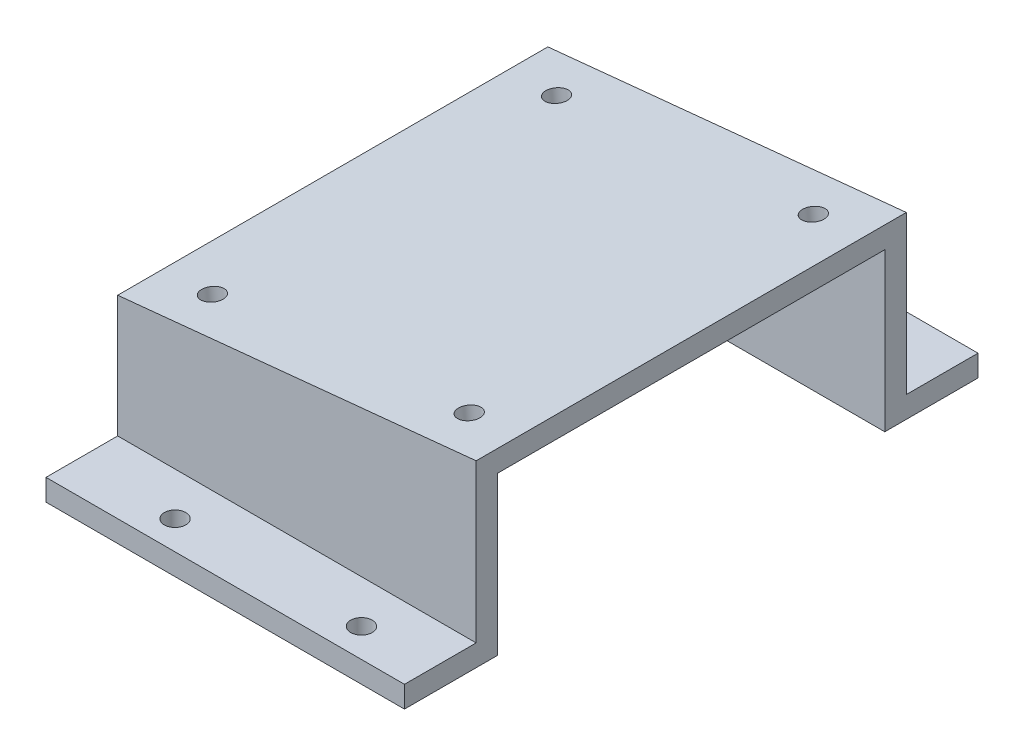
ISO-10303-21;
HEADER;
FILE_DESCRIPTION(('STEP AP214'),'2;1');
FILE_NAME('part.step','',(''),(''),'','','');
FILE_SCHEMA(('AUTOMOTIVE_DESIGN { 1 0 10303 214 1 1 1 1 }'));
ENDSEC;
DATA;
#1=APPLICATION_CONTEXT('core data for automotive mechanical design processes');
#2=APPLICATION_PROTOCOL_DEFINITION('international standard','automotive_design',2000,#1);
#3=PRODUCT_CONTEXT('',#1,'mechanical');
#4=PRODUCT('Part','Part','',(#3));
#5=PRODUCT_RELATED_PRODUCT_CATEGORY('part','',(#4));
#6=PRODUCT_DEFINITION_FORMATION('','',#4);
#7=PRODUCT_DEFINITION_CONTEXT('part definition',#1,'design');
#8=PRODUCT_DEFINITION('design','',#6,#7);
#9=PRODUCT_DEFINITION_SHAPE('','',#8);
#10=(LENGTH_UNIT() NAMED_UNIT(*) SI_UNIT(.MILLI.,.METRE.));
#11=(NAMED_UNIT(*) PLANE_ANGLE_UNIT() SI_UNIT($,.RADIAN.));
#12=(NAMED_UNIT(*) SI_UNIT($,.STERADIAN.) SOLID_ANGLE_UNIT());
#13=UNCERTAINTY_MEASURE_WITH_UNIT(LENGTH_MEASURE(1.E-05),#10,'distance_accuracy_value','');
#14=(GEOMETRIC_REPRESENTATION_CONTEXT(3) GLOBAL_UNCERTAINTY_ASSIGNED_CONTEXT((#13)) GLOBAL_UNIT_ASSIGNED_CONTEXT((#10,
#11,#12)) REPRESENTATION_CONTEXT('',''));
#15=CARTESIAN_POINT('',(0.,0.,0.));
#16=DIRECTION('',(0.,0.,1.));
#17=DIRECTION('',(1.,0.,0.));
#18=AXIS2_PLACEMENT_3D('',#15,#16,#17);
#19=CARTESIAN_POINT('',(0.,0.,3.));
#20=DIRECTION('',(0.,0.,-1.));
#21=DIRECTION('',(-1.,0.,0.));
#22=AXIS2_PLACEMENT_3D('',#19,#20,#21);
#23=PLANE('',#22);
#24=DIRECTION('',(0.995037190209989,0.0995037190209989,0.));
#25=VECTOR('',#24,1.);
#26=CARTESIAN_POINT('',(0.,17.,3.));
#27=LINE('',#26,#25);
#28=CARTESIAN_POINT('',(0.,17.,3.));
#29=VERTEX_POINT('',#28);
#30=CARTESIAN_POINT('',(50.,22.,3.));
#31=VERTEX_POINT('',#30);
#32=EDGE_CURVE('E233',#29,#31,#27,.T.);
#33=ORIENTED_EDGE('',*,*,#32,.F.);
#34=DIRECTION('',(0.,-1.,0.));
#35=VECTOR('',#34,1.);
#36=CARTESIAN_POINT('',(0.,0.,3.));
#37=LINE('',#36,#35);
#38=CARTESIAN_POINT('',(0.,0.,3.));
#39=VERTEX_POINT('',#38);
#40=EDGE_CURVE('E249',#29,#39,#37,.T.);
#41=ORIENTED_EDGE('',*,*,#40,.T.);
#42=DIRECTION('',(1.,0.,0.));
#43=VECTOR('',#42,1.);
#44=CARTESIAN_POINT('',(0.,0.,3.));
#45=LINE('',#44,#43);
#46=CARTESIAN_POINT('',(50.,0.,3.));
#47=VERTEX_POINT('',#46);
#48=EDGE_CURVE('E252',#39,#47,#45,.T.);
#49=ORIENTED_EDGE('',*,*,#48,.T.);
#50=DIRECTION('',(0.,1.,0.));
#51=VECTOR('',#50,1.);
#52=CARTESIAN_POINT('',(50.,25.,3.));
#53=LINE('',#52,#51);
#54=EDGE_CURVE('E143',#47,#31,#53,.T.);
#55=ORIENTED_EDGE('',*,*,#54,.T.);
#56=EDGE_LOOP('',(#33,#41,#49,#55));
#57=FACE_BOUND('',#56,.T.);
#58=ADVANCED_FACE('F44',(#57),#23,.F.);
#59=CARTESIAN_POINT('',(0.,0.,3.));
#60=DIRECTION('',(1.,0.,0.));
#61=DIRECTION('',(0.,0.,-1.));
#62=AXIS2_PLACEMENT_3D('',#59,#60,#61);
#63=PLANE('',#62);
#64=DIRECTION('',(0.,-1.,0.));
#65=VECTOR('',#64,1.);
#66=CARTESIAN_POINT('',(0.,0.,0.));
#67=LINE('',#66,#65);
#68=CARTESIAN_POINT('',(0.,20.,0.));
#69=VERTEX_POINT('',#68);
#70=CARTESIAN_POINT('',(0.,3.,0.));
#71=VERTEX_POINT('',#70);
#72=EDGE_CURVE('E248',#69,#71,#67,.T.);
#73=ORIENTED_EDGE('',*,*,#72,.T.);
#74=DIRECTION('',(0.,0.,1.));
#75=VECTOR('',#74,1.);
#76=CARTESIAN_POINT('',(0.,3.,-10.));
#77=LINE('',#76,#75);
#78=CARTESIAN_POINT('',(0.,3.,-10.));
#79=VERTEX_POINT('',#78);
#80=EDGE_CURVE('E177',#79,#71,#77,.T.);
#81=ORIENTED_EDGE('',*,*,#80,.F.);
#82=DIRECTION('',(0.,1.,0.));
#83=VECTOR('',#82,1.);
#84=CARTESIAN_POINT('',(0.,0.,-10.));
#85=LINE('',#84,#83);
#86=CARTESIAN_POINT('',(0.,0.,-10.));
#87=VERTEX_POINT('',#86);
#88=EDGE_CURVE('E156',#87,#79,#85,.T.);
#89=ORIENTED_EDGE('',*,*,#88,.F.);
#90=DIRECTION('',(0.,0.,-1.));
#91=VECTOR('',#90,1.);
#92=CARTESIAN_POINT('',(0.,0.,3.));
#93=LINE('',#92,#91);
#94=EDGE_CURVE('E11',#39,#87,#93,.T.);
#95=ORIENTED_EDGE('',*,*,#94,.F.);
#96=ORIENTED_EDGE('',*,*,#40,.F.);
#97=DIRECTION('',(0.,0.,-1.));
#98=VECTOR('',#97,1.);
#99=CARTESIAN_POINT('',(0.,17.,57.));
#100=LINE('',#99,#98);
#101=CARTESIAN_POINT('',(0.,17.,57.));
#102=VERTEX_POINT('',#101);
#103=EDGE_CURVE('E244',#102,#29,#100,.T.);
#104=ORIENTED_EDGE('',*,*,#103,.F.);
#105=DIRECTION('',(0.,-1.,0.));
#106=VECTOR('',#105,1.);
#107=CARTESIAN_POINT('',(0.,0.,57.));
#108=LINE('',#107,#106);
#109=CARTESIAN_POINT('',(0.,0.,57.));
#110=VERTEX_POINT('',#109);
#111=EDGE_CURVE('E205',#102,#110,#108,.T.);
#112=ORIENTED_EDGE('',*,*,#111,.T.);
#113=DIRECTION('',(0.,0.,-1.));
#114=VECTOR('',#113,1.);
#115=CARTESIAN_POINT('',(0.,0.,60.));
#116=LINE('',#115,#114);
#117=CARTESIAN_POINT('',(0.,0.,70.));
#118=VERTEX_POINT('',#117);
#119=EDGE_CURVE('E229',#118,#110,#116,.T.);
#120=ORIENTED_EDGE('',*,*,#119,.F.);
#121=DIRECTION('',(0.,-1.,0.));
#122=VECTOR('',#121,1.);
#123=CARTESIAN_POINT('',(0.,0.,70.));
#124=LINE('',#123,#122);
#125=CARTESIAN_POINT('',(0.,2.99999999999999,70.));
#126=VERTEX_POINT('',#125);
#127=EDGE_CURVE('E191',#126,#118,#124,.T.);
#128=ORIENTED_EDGE('',*,*,#127,.F.);
#129=DIRECTION('',(0.,0.,-1.));
#130=VECTOR('',#129,1.);
#131=CARTESIAN_POINT('',(0.,2.99999999999999,70.));
#132=LINE('',#131,#130);
#133=CARTESIAN_POINT('',(0.,2.99999999999999,60.));
#134=VERTEX_POINT('',#133);
#135=EDGE_CURVE('E195',#126,#134,#132,.T.);
#136=ORIENTED_EDGE('',*,*,#135,.T.);
#137=DIRECTION('',(0.,-1.,0.));
#138=VECTOR('',#137,1.);
#139=CARTESIAN_POINT('',(0.,0.,60.));
#140=LINE('',#139,#138);
#141=CARTESIAN_POINT('',(0.,20.,60.));
#142=VERTEX_POINT('',#141);
#143=EDGE_CURVE('E206',#142,#134,#140,.T.);
#144=ORIENTED_EDGE('',*,*,#143,.F.);
#145=DIRECTION('',(0.,0.,-1.));
#146=VECTOR('',#145,1.);
#147=CARTESIAN_POINT('',(0.,20.,3.));
#148=LINE('',#147,#146);
#149=EDGE_CURVE('E258',#142,#69,#148,.T.);
#150=ORIENTED_EDGE('',*,*,#149,.T.);
#151=EDGE_LOOP('',(#73,#81,#89,#95,#96,#104,#112,#120,#128,#136,#144,#150));
#152=FACE_BOUND('',#151,.T.);
#153=ADVANCED_FACE('F46',(#152),#63,.F.);
#154=CARTESIAN_POINT('',(0.,0.,3.));
#155=DIRECTION('',(0.,1.,0.));
#156=DIRECTION('',(0.,0.,1.));
#157=AXIS2_PLACEMENT_3D('',#154,#155,#156);
#158=PLANE('',#157);
#159=CARTESIAN_POINT('',(14.,0.,-6.00000000000001));
#160=DIRECTION('',(0.,1.,0.));
#161=DIRECTION('',(0.,0.,1.));
#162=AXIS2_PLACEMENT_3D('',#159,#160,#161);
#163=CIRCLE('',#162,1.5);
#164=CARTESIAN_POINT('',(14.,0.,-4.5));
#165=VERTEX_POINT('',#164);
#166=EDGE_CURVE('E310',#165,#165,#163,.T.);
#167=ORIENTED_EDGE('',*,*,#166,.T.);
#168=EDGE_LOOP('',(#167));
#169=FACE_BOUND('',#168,.T.);
#170=CARTESIAN_POINT('',(40.,0.,-6.00000000000001));
#171=DIRECTION('',(0.,1.,0.));
#172=DIRECTION('',(0.,0.,1.));
#173=AXIS2_PLACEMENT_3D('',#170,#171,#172);
#174=CIRCLE('',#173,1.5);
#175=CARTESIAN_POINT('',(40.,0.,-4.5));
#176=VERTEX_POINT('',#175);
#177=EDGE_CURVE('E306',#176,#176,#174,.T.);
#178=ORIENTED_EDGE('',*,*,#177,.T.);
#179=EDGE_LOOP('',(#178));
#180=FACE_BOUND('',#179,.T.);
#181=ORIENTED_EDGE('',*,*,#94,.T.);
#182=DIRECTION('',(-1.,0.,0.));
#183=VECTOR('',#182,1.);
#184=CARTESIAN_POINT('',(50.,0.,-10.));
#185=LINE('',#184,#183);
#186=CARTESIAN_POINT('',(50.,0.,-10.));
#187=VERTEX_POINT('',#186);
#188=EDGE_CURVE('E150',#187,#87,#185,.T.);
#189=ORIENTED_EDGE('',*,*,#188,.F.);
#190=DIRECTION('',(0.,0.,-1.));
#191=VECTOR('',#190,1.);
#192=CARTESIAN_POINT('',(50.,0.,3.));
#193=LINE('',#192,#191);
#194=EDGE_CURVE('E54',#47,#187,#193,.T.);
#195=ORIENTED_EDGE('',*,*,#194,.F.);
#196=ORIENTED_EDGE('',*,*,#48,.F.);
#197=EDGE_LOOP('',(#181,#189,#195,#196));
#198=FACE_BOUND('',#197,.T.);
#199=ADVANCED_FACE('F151',(#169,#180,#198),#158,.F.);
#200=CARTESIAN_POINT('',(50.,25.,3.));
#201=DIRECTION('',(-1.,0.,0.));
#202=DIRECTION('',(0.,-1.,0.));
#203=AXIS2_PLACEMENT_3D('',#200,#201,#202);
#204=PLANE('',#203);
#205=ORIENTED_EDGE('',*,*,#194,.T.);
#206=DIRECTION('',(0.,-1.,0.));
#207=VECTOR('',#206,1.);
#208=CARTESIAN_POINT('',(50.,2.99999999999999,-10.));
#209=LINE('',#208,#207);
#210=CARTESIAN_POINT('',(50.,2.99999999999999,-10.));
#211=VERTEX_POINT('',#210);
#212=EDGE_CURVE('E141',#211,#187,#209,.T.);
#213=ORIENTED_EDGE('',*,*,#212,.F.);
#214=DIRECTION('',(0.,0.,1.));
#215=VECTOR('',#214,1.);
#216=CARTESIAN_POINT('',(50.,2.99999999999999,-10.));
#217=LINE('',#216,#215);
#218=CARTESIAN_POINT('',(50.,2.99999999999999,0.));
#219=VERTEX_POINT('',#218);
#220=EDGE_CURVE('E173',#211,#219,#217,.T.);
#221=ORIENTED_EDGE('',*,*,#220,.T.);
#222=DIRECTION('',(0.,1.,0.));
#223=VECTOR('',#222,1.);
#224=CARTESIAN_POINT('',(50.,25.,0.));
#225=LINE('',#224,#223);
#226=CARTESIAN_POINT('',(50.,25.,0.));
#227=VERTEX_POINT('',#226);
#228=EDGE_CURVE('E261',#219,#227,#225,.T.);
#229=ORIENTED_EDGE('',*,*,#228,.T.);
#230=DIRECTION('',(0.,0.,-1.));
#231=VECTOR('',#230,1.);
#232=CARTESIAN_POINT('',(50.,25.,3.));
#233=LINE('',#232,#231);
#234=CARTESIAN_POINT('',(50.,25.,60.));
#235=VERTEX_POINT('',#234);
#236=EDGE_CURVE('E147',#235,#227,#233,.T.);
#237=ORIENTED_EDGE('',*,*,#236,.F.);
#238=DIRECTION('',(0.,1.,0.));
#239=VECTOR('',#238,1.);
#240=CARTESIAN_POINT('',(50.,25.,60.));
#241=LINE('',#240,#239);
#242=CARTESIAN_POINT('',(50.,3.,60.));
#243=VERTEX_POINT('',#242);
#244=EDGE_CURVE('E209',#243,#235,#241,.T.);
#245=ORIENTED_EDGE('',*,*,#244,.F.);
#246=DIRECTION('',(0.,0.,-1.));
#247=VECTOR('',#246,1.);
#248=CARTESIAN_POINT('',(50.,2.99999999999999,70.));
#249=LINE('',#248,#247);
#250=CARTESIAN_POINT('',(50.,2.99999999999999,70.));
#251=VERTEX_POINT('',#250);
#252=EDGE_CURVE('E201',#251,#243,#249,.T.);
#253=ORIENTED_EDGE('',*,*,#252,.F.);
#254=DIRECTION('',(0.,1.,0.));
#255=VECTOR('',#254,1.);
#256=CARTESIAN_POINT('',(50.,2.99999999999999,70.));
#257=LINE('',#256,#255);
#258=CARTESIAN_POINT('',(50.,0.,70.));
#259=VERTEX_POINT('',#258);
#260=EDGE_CURVE('E185',#259,#251,#257,.T.);
#261=ORIENTED_EDGE('',*,*,#260,.F.);
#262=DIRECTION('',(0.,0.,-1.));
#263=VECTOR('',#262,1.);
#264=CARTESIAN_POINT('',(50.,0.,60.));
#265=LINE('',#264,#263);
#266=CARTESIAN_POINT('',(50.,0.,57.));
#267=VERTEX_POINT('',#266);
#268=EDGE_CURVE('E217',#259,#267,#265,.T.);
#269=ORIENTED_EDGE('',*,*,#268,.T.);
#270=DIRECTION('',(0.,1.,0.));
#271=VECTOR('',#270,1.);
#272=CARTESIAN_POINT('',(50.,25.,57.));
#273=LINE('',#272,#271);
#274=CARTESIAN_POINT('',(50.,22.,57.));
#275=VERTEX_POINT('',#274);
#276=EDGE_CURVE('E210',#267,#275,#273,.T.);
#277=ORIENTED_EDGE('',*,*,#276,.T.);
#278=DIRECTION('',(0.,0.,-1.));
#279=VECTOR('',#278,1.);
#280=CARTESIAN_POINT('',(50.,22.,57.));
#281=LINE('',#280,#279);
#282=EDGE_CURVE('E238',#275,#31,#281,.T.);
#283=ORIENTED_EDGE('',*,*,#282,.T.);
#284=ORIENTED_EDGE('',*,*,#54,.F.);
#285=EDGE_LOOP('',(#205,#213,#221,#229,#237,#245,#253,#261,#269,#277,#283,#284));
#286=FACE_BOUND('',#285,.T.);
#287=ADVANCED_FACE('F138',(#286),#204,.F.);
#288=CARTESIAN_POINT('',(0.,20.,3.));
#289=DIRECTION('',(0.0995037190209989,-0.995037190209989,0.));
#290=DIRECTION('',(0.995037190209989,0.0995037190209989,0.));
#291=AXIS2_PLACEMENT_3D('',#288,#289,#290);
#292=PLANE('',#291);
#293=CARTESIAN_POINT('',(43.0347396685301,24.303473966853,6.00000000000001));
#294=DIRECTION('',(-0.099503719020999,0.995037190209989,0.));
#295=DIRECTION('',(-0.995037190209989,-0.099503719020999,0.));
#296=AXIS2_PLACEMENT_3D('',#293,#294,#295);
#297=CIRCLE('',#296,1.50000000000001);
#298=CARTESIAN_POINT('',(41.5421838832151,24.1542183883215,6.00000000000001));
#299=VERTEX_POINT('',#298);
#300=EDGE_CURVE('E644',#299,#299,#297,.T.);
#301=ORIENTED_EDGE('',*,*,#300,.F.);
#302=EDGE_LOOP('',(#301));
#303=FACE_BOUND('',#302,.T.);
#304=CARTESIAN_POINT('',(7.21340082097049,20.7213400820971,54.));
#305=DIRECTION('',(-0.099503719020999,0.995037190209989,0.));
#306=DIRECTION('',(-0.995037190209989,-0.099503719020999,0.));
#307=AXIS2_PLACEMENT_3D('',#304,#305,#306);
#308=CIRCLE('',#307,1.5);
#309=CARTESIAN_POINT('',(5.72084503565551,20.5720845035656,54.));
#310=VERTEX_POINT('',#309);
#311=EDGE_CURVE('E646',#310,#310,#308,.T.);
#312=ORIENTED_EDGE('',*,*,#311,.F.);
#313=EDGE_LOOP('',(#312));
#314=FACE_BOUND('',#313,.T.);
#315=CARTESIAN_POINT('',(7.21340082097048,20.7213400820971,6.00000000000001));
#316=DIRECTION('',(-0.099503719020999,0.995037190209989,0.));
#317=DIRECTION('',(0.995037190209989,0.099503719020999,0.));
#318=AXIS2_PLACEMENT_3D('',#315,#316,#317);
#319=CIRCLE('',#318,1.5);
#320=CARTESIAN_POINT('',(8.70595660628546,20.8705956606286,6.00000000000001));
#321=VERTEX_POINT('',#320);
#322=EDGE_CURVE('E653',#321,#321,#319,.T.);
#323=ORIENTED_EDGE('',*,*,#322,.F.);
#324=EDGE_LOOP('',(#323));
#325=FACE_BOUND('',#324,.T.);
#326=CARTESIAN_POINT('',(43.0347396685301,24.303473966853,54.));
#327=DIRECTION('',(-0.099503719020999,0.995037190209989,0.));
#328=DIRECTION('',(0.995037190209989,0.099503719020999,0.));
#329=AXIS2_PLACEMENT_3D('',#326,#327,#328);
#330=CIRCLE('',#329,1.50000000000001);
#331=CARTESIAN_POINT('',(44.5272954538451,24.4527295453845,54.));
#332=VERTEX_POINT('',#331);
#333=EDGE_CURVE('E277',#332,#332,#330,.T.);
#334=ORIENTED_EDGE('',*,*,#333,.F.);
#335=EDGE_LOOP('',(#334));
#336=FACE_BOUND('',#335,.T.);
#337=DIRECTION('',(-0.995037190209989,-0.0995037190209989,0.));
#338=VECTOR('',#337,1.);
#339=CARTESIAN_POINT('',(0.,20.,0.));
#340=LINE('',#339,#338);
#341=EDGE_CURVE('E253',#227,#69,#340,.T.);
#342=ORIENTED_EDGE('',*,*,#341,.T.);
#343=ORIENTED_EDGE('',*,*,#149,.F.);
#344=DIRECTION('',(-0.995037190209989,-0.0995037190209989,0.));
#345=VECTOR('',#344,1.);
#346=CARTESIAN_POINT('',(0.,20.,60.));
#347=LINE('',#346,#345);
#348=EDGE_CURVE('E213',#235,#142,#347,.T.);
#349=ORIENTED_EDGE('',*,*,#348,.F.);
#350=ORIENTED_EDGE('',*,*,#236,.T.);
#351=EDGE_LOOP('',(#342,#343,#349,#350));
#352=FACE_BOUND('',#351,.T.);
#353=ADVANCED_FACE('F356',(#303,#314,#325,#336,#352),#292,.F.);
#354=CARTESIAN_POINT('',(0.,0.,0.));
#355=DIRECTION('',(0.,0.,-1.));
#356=DIRECTION('',(-1.,0.,0.));
#357=AXIS2_PLACEMENT_3D('',#354,#355,#356);
#358=PLANE('',#357);
#359=DIRECTION('',(1.,0.,0.));
#360=VECTOR('',#359,1.);
#361=CARTESIAN_POINT('',(0.,3.,0.));
#362=LINE('',#361,#360);
#363=EDGE_CURVE('E62',#71,#219,#362,.T.);
#364=ORIENTED_EDGE('',*,*,#363,.F.);
#365=ORIENTED_EDGE('',*,*,#72,.F.);
#366=ORIENTED_EDGE('',*,*,#341,.F.);
#367=ORIENTED_EDGE('',*,*,#228,.F.);
#368=EDGE_LOOP('',(#364,#365,#366,#367));
#369=FACE_BOUND('',#368,.T.);
#370=ADVANCED_FACE('F353',(#369),#358,.T.);
#371=CARTESIAN_POINT('',(0.,17.,57.));
#372=DIRECTION('',(-0.0995037190209989,0.995037190209989,0.));
#373=DIRECTION('',(-0.995037190209989,-0.0995037190209989,0.));
#374=AXIS2_PLACEMENT_3D('',#371,#372,#373);
#375=PLANE('',#374);
#376=CARTESIAN_POINT('',(43.3317693715004,21.33317693715,6.00000000000001));
#377=DIRECTION('',(-0.0995037190209989,0.995037190209989,0.));
#378=DIRECTION('',(-0.995037190209989,-0.0995037190209989,0.));
#379=AXIS2_PLACEMENT_3D('',#376,#377,#378);
#380=CIRCLE('',#379,1.50000000000001);
#381=CARTESIAN_POINT('',(41.8392135861854,21.1839213586185,6.00000000000001));
#382=VERTEX_POINT('',#381);
#383=EDGE_CURVE('E48',#382,#382,#380,.T.);
#384=ORIENTED_EDGE('',*,*,#383,.T.);
#385=EDGE_LOOP('',(#384));
#386=FACE_BOUND('',#385,.T.);
#387=CARTESIAN_POINT('',(7.51043052394079,17.7510430523941,54.));
#388=DIRECTION('',(-0.0995037190209989,0.995037190209989,0.));
#389=DIRECTION('',(-0.995037190209989,-0.0995037190209989,0.));
#390=AXIS2_PLACEMENT_3D('',#387,#388,#389);
#391=CIRCLE('',#390,1.5);
#392=CARTESIAN_POINT('',(6.0178747386258,17.6017874738626,54.));
#393=VERTEX_POINT('',#392);
#394=EDGE_CURVE('E280',#393,#393,#391,.T.);
#395=ORIENTED_EDGE('',*,*,#394,.T.);
#396=EDGE_LOOP('',(#395));
#397=FACE_BOUND('',#396,.T.);
#398=CARTESIAN_POINT('',(7.51043052394078,17.7510430523941,6.00000000000001));
#399=DIRECTION('',(-0.0995037190209989,0.995037190209989,0.));
#400=DIRECTION('',(-0.995037190209989,-0.0995037190209989,0.));
#401=AXIS2_PLACEMENT_3D('',#398,#399,#400);
#402=CIRCLE('',#401,1.5);
#403=CARTESIAN_POINT('',(6.01787473862579,17.6017874738626,6.00000000000001));
#404=VERTEX_POINT('',#403);
#405=EDGE_CURVE('E276',#404,#404,#402,.T.);
#406=ORIENTED_EDGE('',*,*,#405,.T.);
#407=EDGE_LOOP('',(#406));
#408=FACE_BOUND('',#407,.T.);
#409=CARTESIAN_POINT('',(43.3317693715004,21.33317693715,54.));
#410=DIRECTION('',(-0.0995037190209989,0.995037190209989,0.));
#411=DIRECTION('',(-0.995037190209989,-0.0995037190209989,0.));
#412=AXIS2_PLACEMENT_3D('',#409,#410,#411);
#413=CIRCLE('',#412,1.50000000000001);
#414=CARTESIAN_POINT('',(41.8392135861854,21.1839213586185,54.));
#415=VERTEX_POINT('',#414);
#416=EDGE_CURVE('E272',#415,#415,#413,.T.);
#417=ORIENTED_EDGE('',*,*,#416,.T.);
#418=EDGE_LOOP('',(#417));
#419=FACE_BOUND('',#418,.T.);
#420=ORIENTED_EDGE('',*,*,#32,.T.);
#421=ORIENTED_EDGE('',*,*,#282,.F.);
#422=DIRECTION('',(0.995037190209989,0.0995037190209989,0.));
#423=VECTOR('',#422,1.);
#424=CARTESIAN_POINT('',(0.,17.,57.));
#425=LINE('',#424,#423);
#426=EDGE_CURVE('E234',#102,#275,#425,.T.);
#427=ORIENTED_EDGE('',*,*,#426,.F.);
#428=ORIENTED_EDGE('',*,*,#103,.T.);
#429=EDGE_LOOP('',(#420,#421,#427,#428));
#430=FACE_BOUND('',#429,.T.);
#431=ADVANCED_FACE('F351',(#386,#397,#408,#419,#430),#375,.F.);
#432=CARTESIAN_POINT('',(0.,0.,57.));
#433=DIRECTION('',(0.,0.,1.));
#434=DIRECTION('',(1.,0.,0.));
#435=AXIS2_PLACEMENT_3D('',#432,#433,#434);
#436=PLANE('',#435);
#437=ORIENTED_EDGE('',*,*,#111,.F.);
#438=ORIENTED_EDGE('',*,*,#426,.T.);
#439=ORIENTED_EDGE('',*,*,#276,.F.);
#440=DIRECTION('',(1.,0.,0.));
#441=VECTOR('',#440,1.);
#442=CARTESIAN_POINT('',(50.,0.,57.));
#443=LINE('',#442,#441);
#444=EDGE_CURVE('E220',#110,#267,#443,.T.);
#445=ORIENTED_EDGE('',*,*,#444,.F.);
#446=EDGE_LOOP('',(#437,#438,#439,#445));
#447=FACE_BOUND('',#446,.T.);
#448=ADVANCED_FACE('F394',(#447),#436,.F.);
#449=CARTESIAN_POINT('',(50.,0.,60.));
#450=DIRECTION('',(0.,1.,0.));
#451=DIRECTION('',(0.,0.,1.));
#452=AXIS2_PLACEMENT_3D('',#449,#450,#451);
#453=PLANE('',#452);
#454=CARTESIAN_POINT('',(40.,0.,66.));
#455=DIRECTION('',(0.,1.,0.));
#456=DIRECTION('',(0.,0.,1.));
#457=AXIS2_PLACEMENT_3D('',#454,#455,#456);
#458=CIRCLE('',#457,1.5);
#459=CARTESIAN_POINT('',(40.,0.,67.5));
#460=VERTEX_POINT('',#459);
#461=EDGE_CURVE('E165',#460,#460,#458,.T.);
#462=ORIENTED_EDGE('',*,*,#461,.T.);
#463=EDGE_LOOP('',(#462));
#464=FACE_BOUND('',#463,.T.);
#465=CARTESIAN_POINT('',(14.,0.,66.));
#466=DIRECTION('',(0.,1.,0.));
#467=DIRECTION('',(0.,0.,1.));
#468=AXIS2_PLACEMENT_3D('',#465,#466,#467);
#469=CIRCLE('',#468,1.5);
#470=CARTESIAN_POINT('',(14.,0.,67.5));
#471=VERTEX_POINT('',#470);
#472=EDGE_CURVE('E313',#471,#471,#469,.T.);
#473=ORIENTED_EDGE('',*,*,#472,.T.);
#474=EDGE_LOOP('',(#473));
#475=FACE_BOUND('',#474,.T.);
#476=ORIENTED_EDGE('',*,*,#444,.T.);
#477=ORIENTED_EDGE('',*,*,#268,.F.);
#478=DIRECTION('',(1.,0.,0.));
#479=VECTOR('',#478,1.);
#480=CARTESIAN_POINT('',(50.,0.,70.));
#481=LINE('',#480,#479);
#482=EDGE_CURVE('E181',#118,#259,#481,.T.);
#483=ORIENTED_EDGE('',*,*,#482,.F.);
#484=ORIENTED_EDGE('',*,*,#119,.T.);
#485=EDGE_LOOP('',(#476,#477,#483,#484));
#486=FACE_BOUND('',#485,.T.);
#487=ADVANCED_FACE('F322',(#464,#475,#486),#453,.F.);
#488=CARTESIAN_POINT('',(0.,0.,60.));
#489=DIRECTION('',(0.,0.,1.));
#490=DIRECTION('',(1.,0.,0.));
#491=AXIS2_PLACEMENT_3D('',#488,#489,#490);
#492=PLANE('',#491);
#493=DIRECTION('',(-1.,0.,0.));
#494=VECTOR('',#493,1.);
#495=CARTESIAN_POINT('',(0.,2.99999999999999,60.));
#496=LINE('',#495,#494);
#497=EDGE_CURVE('E70',#243,#134,#496,.T.);
#498=ORIENTED_EDGE('',*,*,#497,.F.);
#499=ORIENTED_EDGE('',*,*,#244,.T.);
#500=ORIENTED_EDGE('',*,*,#348,.T.);
#501=ORIENTED_EDGE('',*,*,#143,.T.);
#502=EDGE_LOOP('',(#498,#499,#500,#501));
#503=FACE_BOUND('',#502,.T.);
#504=ADVANCED_FACE('F390',(#503),#492,.T.);
#505=CARTESIAN_POINT('',(0.,2.99999999999999,70.));
#506=DIRECTION('',(0.,-1.,0.));
#507=DIRECTION('',(0.,0.,-1.));
#508=AXIS2_PLACEMENT_3D('',#505,#506,#507);
#509=PLANE('',#508);
#510=CARTESIAN_POINT('',(40.,2.99999999999999,66.));
#511=DIRECTION('',(0.,1.,0.));
#512=DIRECTION('',(0.,0.,1.));
#513=AXIS2_PLACEMENT_3D('',#510,#511,#512);
#514=CIRCLE('',#513,1.5);
#515=CARTESIAN_POINT('',(40.,2.99999999999999,67.5));
#516=VERTEX_POINT('',#515);
#517=EDGE_CURVE('E298',#516,#516,#514,.T.);
#518=ORIENTED_EDGE('',*,*,#517,.F.);
#519=EDGE_LOOP('',(#518));
#520=FACE_BOUND('',#519,.T.);
#521=CARTESIAN_POINT('',(14.,2.99999999999999,66.));
#522=DIRECTION('',(0.,1.,0.));
#523=DIRECTION('',(0.,0.,1.));
#524=AXIS2_PLACEMENT_3D('',#521,#522,#523);
#525=CIRCLE('',#524,1.5);
#526=CARTESIAN_POINT('',(14.,2.99999999999999,67.5));
#527=VERTEX_POINT('',#526);
#528=EDGE_CURVE('E302',#527,#527,#525,.T.);
#529=ORIENTED_EDGE('',*,*,#528,.F.);
#530=EDGE_LOOP('',(#529));
#531=FACE_BOUND('',#530,.T.);
#532=ORIENTED_EDGE('',*,*,#497,.T.);
#533=ORIENTED_EDGE('',*,*,#135,.F.);
#534=DIRECTION('',(-1.,0.,0.));
#535=VECTOR('',#534,1.);
#536=CARTESIAN_POINT('',(0.,2.99999999999999,70.));
#537=LINE('',#536,#535);
#538=EDGE_CURVE('E188',#251,#126,#537,.T.);
#539=ORIENTED_EDGE('',*,*,#538,.F.);
#540=ORIENTED_EDGE('',*,*,#252,.T.);
#541=EDGE_LOOP('',(#532,#533,#539,#540));
#542=FACE_BOUND('',#541,.T.);
#543=ADVANCED_FACE('F386',(#520,#531,#542),#509,.F.);
#544=CARTESIAN_POINT('',(0.,0.,70.));
#545=DIRECTION('',(0.,0.,-1.));
#546=DIRECTION('',(-1.,0.,0.));
#547=AXIS2_PLACEMENT_3D('',#544,#545,#546);
#548=PLANE('',#547);
#549=ORIENTED_EDGE('',*,*,#482,.T.);
#550=ORIENTED_EDGE('',*,*,#260,.T.);
#551=ORIENTED_EDGE('',*,*,#538,.T.);
#552=ORIENTED_EDGE('',*,*,#127,.T.);
#553=EDGE_LOOP('',(#549,#550,#551,#552));
#554=FACE_BOUND('',#553,.T.);
#555=ADVANCED_FACE('F382',(#554),#548,.F.);
#556=CARTESIAN_POINT('',(0.,3.,-10.));
#557=DIRECTION('',(0.,-1.,0.));
#558=DIRECTION('',(1.,0.,0.));
#559=AXIS2_PLACEMENT_3D('',#556,#557,#558);
#560=PLANE('',#559);
#561=CARTESIAN_POINT('',(14.,2.99999999999999,-6.00000000000001));
#562=DIRECTION('',(0.,1.,0.));
#563=DIRECTION('',(0.,0.,-1.));
#564=AXIS2_PLACEMENT_3D('',#561,#562,#563);
#565=CIRCLE('',#564,1.5);
#566=CARTESIAN_POINT('',(14.,2.99999999999999,-7.50000000000001));
#567=VERTEX_POINT('',#566);
#568=EDGE_CURVE('E287',#567,#567,#565,.T.);
#569=ORIENTED_EDGE('',*,*,#568,.F.);
#570=EDGE_LOOP('',(#569));
#571=FACE_BOUND('',#570,.T.);
#572=CARTESIAN_POINT('',(40.,2.99999999999999,-6.00000000000001));
#573=DIRECTION('',(0.,1.,0.));
#574=DIRECTION('',(0.,0.,-1.));
#575=AXIS2_PLACEMENT_3D('',#572,#573,#574);
#576=CIRCLE('',#575,1.5);
#577=CARTESIAN_POINT('',(40.,2.99999999999999,-7.50000000000001));
#578=VERTEX_POINT('',#577);
#579=EDGE_CURVE('E292',#578,#578,#576,.T.);
#580=ORIENTED_EDGE('',*,*,#579,.F.);
#581=EDGE_LOOP('',(#580));
#582=FACE_BOUND('',#581,.T.);
#583=ORIENTED_EDGE('',*,*,#363,.T.);
#584=ORIENTED_EDGE('',*,*,#220,.F.);
#585=DIRECTION('',(1.,0.,0.));
#586=VECTOR('',#585,1.);
#587=CARTESIAN_POINT('',(0.,3.,-10.));
#588=LINE('',#587,#586);
#589=EDGE_CURVE('E160',#79,#211,#588,.T.);
#590=ORIENTED_EDGE('',*,*,#589,.F.);
#591=ORIENTED_EDGE('',*,*,#80,.T.);
#592=EDGE_LOOP('',(#583,#584,#590,#591));
#593=FACE_BOUND('',#592,.T.);
#594=ADVANCED_FACE('F377',(#571,#582,#593),#560,.F.);
#595=CARTESIAN_POINT('',(0.,0.,-10.));
#596=DIRECTION('',(0.,0.,-1.));
#597=DIRECTION('',(-1.,0.,0.));
#598=AXIS2_PLACEMENT_3D('',#595,#596,#597);
#599=PLANE('',#598);
#600=ORIENTED_EDGE('',*,*,#212,.T.);
#601=ORIENTED_EDGE('',*,*,#188,.T.);
#602=ORIENTED_EDGE('',*,*,#88,.T.);
#603=ORIENTED_EDGE('',*,*,#589,.T.);
#604=EDGE_LOOP('',(#600,#601,#602,#603));
#605=FACE_BOUND('',#604,.T.);
#606=ADVANCED_FACE('F158',(#605),#599,.T.);
#607=CARTESIAN_POINT('',(40.,-4.00000000000001,-6.00000000000001));
#608=DIRECTION('',(0.,1.,0.));
#609=DIRECTION('',(0.,0.,1.));
#610=AXIS2_PLACEMENT_3D('',#607,#608,#609);
#611=CYLINDRICAL_SURFACE('',#610,1.5);
#612=ORIENTED_EDGE('',*,*,#579,.T.);
#613=EDGE_LOOP('',(#612));
#614=FACE_BOUND('',#613,.T.);
#615=ORIENTED_EDGE('',*,*,#177,.F.);
#616=EDGE_LOOP('',(#615));
#617=FACE_BOUND('',#616,.T.);
#618=ADVANCED_FACE('F369',(#614,#617),#611,.F.);
#619=CARTESIAN_POINT('',(14.,-4.00000000000001,-6.00000000000001));
#620=DIRECTION('',(0.,1.,0.));
#621=DIRECTION('',(0.,0.,1.));
#622=AXIS2_PLACEMENT_3D('',#619,#620,#621);
#623=CYLINDRICAL_SURFACE('',#622,1.5);
#624=ORIENTED_EDGE('',*,*,#568,.T.);
#625=EDGE_LOOP('',(#624));
#626=FACE_BOUND('',#625,.T.);
#627=ORIENTED_EDGE('',*,*,#166,.F.);
#628=EDGE_LOOP('',(#627));
#629=FACE_BOUND('',#628,.T.);
#630=ADVANCED_FACE('F337',(#626,#629),#623,.F.);
#631=CARTESIAN_POINT('',(14.,-4.00000000000001,66.));
#632=DIRECTION('',(0.,1.,0.));
#633=DIRECTION('',(0.,0.,1.));
#634=AXIS2_PLACEMENT_3D('',#631,#632,#633);
#635=CYLINDRICAL_SURFACE('',#634,1.5);
#636=ORIENTED_EDGE('',*,*,#528,.T.);
#637=EDGE_LOOP('',(#636));
#638=FACE_BOUND('',#637,.T.);
#639=ORIENTED_EDGE('',*,*,#472,.F.);
#640=EDGE_LOOP('',(#639));
#641=FACE_BOUND('',#640,.T.);
#642=ADVANCED_FACE('F327',(#638,#641),#635,.F.);
#643=CARTESIAN_POINT('',(40.,-4.00000000000001,66.));
#644=DIRECTION('',(0.,1.,0.));
#645=DIRECTION('',(0.,0.,1.));
#646=AXIS2_PLACEMENT_3D('',#643,#644,#645);
#647=CYLINDRICAL_SURFACE('',#646,1.5);
#648=ORIENTED_EDGE('',*,*,#517,.T.);
#649=EDGE_LOOP('',(#648));
#650=FACE_BOUND('',#649,.T.);
#651=ORIENTED_EDGE('',*,*,#461,.F.);
#652=EDGE_LOOP('',(#651));
#653=FACE_BOUND('',#652,.T.);
#654=ADVANCED_FACE('F324',(#650,#653),#647,.F.);
#655=CARTESIAN_POINT('',(43.7312657016771,17.3382136353831,54.));
#656=DIRECTION('',(-0.099503719020999,0.995037190209989,0.));
#657=DIRECTION('',(-0.995037190209989,-0.099503719020999,0.));
#658=AXIS2_PLACEMENT_3D('',#655,#656,#657);
#659=CYLINDRICAL_SURFACE('',#658,1.50000000000001);
#660=ORIENTED_EDGE('',*,*,#333,.T.);
#661=EDGE_LOOP('',(#660));
#662=FACE_BOUND('',#661,.T.);
#663=ORIENTED_EDGE('',*,*,#416,.F.);
#664=EDGE_LOOP('',(#663));
#665=FACE_BOUND('',#664,.T.);
#666=ADVANCED_FACE('F326',(#662,#665),#659,.F.);
#667=CARTESIAN_POINT('',(7.90992685411747,13.7560797506271,6.00000000000001));
#668=DIRECTION('',(-0.099503719020999,0.995037190209989,0.));
#669=DIRECTION('',(-0.995037190209989,-0.099503719020999,0.));
#670=AXIS2_PLACEMENT_3D('',#667,#668,#669);
#671=CYLINDRICAL_SURFACE('',#670,1.5);
#672=ORIENTED_EDGE('',*,*,#322,.T.);
#673=EDGE_LOOP('',(#672));
#674=FACE_BOUND('',#673,.T.);
#675=ORIENTED_EDGE('',*,*,#405,.F.);
#676=EDGE_LOOP('',(#675));
#677=FACE_BOUND('',#676,.T.);
#678=ADVANCED_FACE('F334',(#674,#677),#671,.F.);
#679=CARTESIAN_POINT('',(7.90992685411749,13.7560797506271,54.));
#680=DIRECTION('',(-0.099503719020999,0.995037190209989,0.));
#681=DIRECTION('',(-0.995037190209989,-0.099503719020999,0.));
#682=AXIS2_PLACEMENT_3D('',#679,#680,#681);
#683=CYLINDRICAL_SURFACE('',#682,1.5);
#684=ORIENTED_EDGE('',*,*,#311,.T.);
#685=EDGE_LOOP('',(#684));
#686=FACE_BOUND('',#685,.T.);
#687=ORIENTED_EDGE('',*,*,#394,.F.);
#688=EDGE_LOOP('',(#687));
#689=FACE_BOUND('',#688,.T.);
#690=ADVANCED_FACE('F497',(#686,#689),#683,.F.);
#691=CARTESIAN_POINT('',(43.7312657016771,17.3382136353831,6.00000000000001));
#692=DIRECTION('',(-0.099503719020999,0.995037190209989,0.));
#693=DIRECTION('',(-0.995037190209989,-0.099503719020999,0.));
#694=AXIS2_PLACEMENT_3D('',#691,#692,#693);
#695=CYLINDRICAL_SURFACE('',#694,1.50000000000001);
#696=ORIENTED_EDGE('',*,*,#300,.T.);
#697=EDGE_LOOP('',(#696));
#698=FACE_BOUND('',#697,.T.);
#699=ORIENTED_EDGE('',*,*,#383,.F.);
#700=EDGE_LOOP('',(#699));
#701=FACE_BOUND('',#700,.T.);
#702=ADVANCED_FACE('F507',(#698,#701),#695,.F.);
#703=CLOSED_SHELL('',(#58,#153,#199,#287,#353,#370,#431,#448,#487,#504,#543,#555,#594,#606,#618,
#630,#642,#654,#666,#678,#690,#702));
#704=MANIFOLD_SOLID_BREP('B2',#703);
#705=ADVANCED_BREP_SHAPE_REPRESENTATION('',(#18,#704),#14);
#706=SHAPE_DEFINITION_REPRESENTATION(#9,#705);
ENDSEC;
END-ISO-10303-21;
